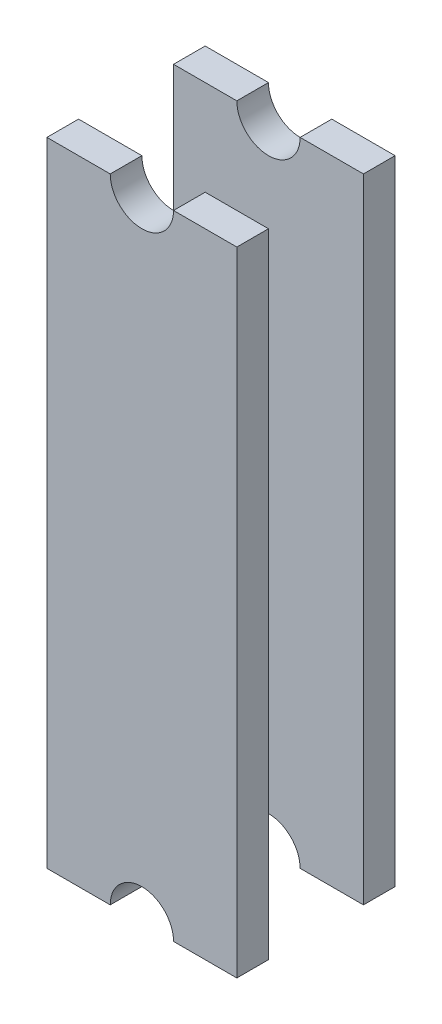
ISO-10303-21;
HEADER;
FILE_DESCRIPTION(('STEP AP214'),'2;1');
FILE_NAME('part.step','',(''),(''),'','','');
FILE_SCHEMA(('AUTOMOTIVE_DESIGN { 1 0 10303 214 1 1 1 1 }'));
ENDSEC;
DATA;
#1=APPLICATION_CONTEXT('core data for automotive mechanical design processes');
#2=APPLICATION_PROTOCOL_DEFINITION('international standard','automotive_design',2000,#1);
#3=PRODUCT_CONTEXT('',#1,'mechanical');
#4=PRODUCT('Part','Part','',(#3));
#5=PRODUCT_RELATED_PRODUCT_CATEGORY('part','',(#4));
#6=PRODUCT_DEFINITION_FORMATION('','',#4);
#7=PRODUCT_DEFINITION_CONTEXT('part definition',#1,'design');
#8=PRODUCT_DEFINITION('design','',#6,#7);
#9=PRODUCT_DEFINITION_SHAPE('','',#8);
#10=(LENGTH_UNIT() NAMED_UNIT(*) SI_UNIT(.MILLI.,.METRE.));
#11=(NAMED_UNIT(*) PLANE_ANGLE_UNIT() SI_UNIT($,.RADIAN.));
#12=(NAMED_UNIT(*) SI_UNIT($,.STERADIAN.) SOLID_ANGLE_UNIT());
#13=UNCERTAINTY_MEASURE_WITH_UNIT(LENGTH_MEASURE(1.E-05),#10,'distance_accuracy_value','');
#14=(GEOMETRIC_REPRESENTATION_CONTEXT(3) GLOBAL_UNCERTAINTY_ASSIGNED_CONTEXT((#13)) GLOBAL_UNIT_ASSIGNED_CONTEXT((#10,
#11,#12)) REPRESENTATION_CONTEXT('',''));
#15=CARTESIAN_POINT('',(0.,0.,0.));
#16=DIRECTION('',(0.,0.,1.));
#17=DIRECTION('',(1.,0.,0.));
#18=AXIS2_PLACEMENT_3D('',#15,#16,#17);
#19=CARTESIAN_POINT('',(-30.,200.,50.));
#20=DIRECTION('',(0.,-1.,0.));
#21=DIRECTION('',(0.,0.,-1.));
#22=AXIS2_PLACEMENT_3D('',#19,#20,#21);
#23=PLANE('',#22);
#24=DIRECTION('',(0.,0.,-1.));
#25=VECTOR('',#24,1.);
#26=CARTESIAN_POINT('',(-10.,200.,100.));
#27=LINE('',#26,#25);
#28=CARTESIAN_POINT('',(-10.,200.,40.));
#29=VERTEX_POINT('',#28);
#30=CARTESIAN_POINT('',(-10.,200.,50.));
#31=VERTEX_POINT('',#30);
#32=EDGE_CURVE('E115',#29,#31,#27,.F.);
#33=ORIENTED_EDGE('',*,*,#32,.F.);
#34=DIRECTION('',(-1.,0.,0.));
#35=VECTOR('',#34,1.);
#36=CARTESIAN_POINT('',(-30.,200.,40.));
#37=LINE('',#36,#35);
#38=CARTESIAN_POINT('',(-30.,200.,40.));
#39=VERTEX_POINT('',#38);
#40=EDGE_CURVE('E121',#29,#39,#37,.T.);
#41=ORIENTED_EDGE('',*,*,#40,.T.);
#42=DIRECTION('',(0.,0.,-1.));
#43=VECTOR('',#42,1.);
#44=CARTESIAN_POINT('',(-30.,200.,50.));
#45=LINE('',#44,#43);
#46=CARTESIAN_POINT('',(-30.,200.,50.));
#47=VERTEX_POINT('',#46);
#48=EDGE_CURVE('E155',#47,#39,#45,.T.);
#49=ORIENTED_EDGE('',*,*,#48,.F.);
#50=DIRECTION('',(-1.,0.,0.));
#51=VECTOR('',#50,1.);
#52=CARTESIAN_POINT('',(-30.,200.,50.));
#53=LINE('',#52,#51);
#54=EDGE_CURVE('E122',#31,#47,#53,.T.);
#55=ORIENTED_EDGE('',*,*,#54,.F.);
#56=EDGE_LOOP('',(#33,#41,#49,#55));
#57=FACE_BOUND('',#56,.T.);
#58=ADVANCED_FACE('F47',(#57),#23,.F.);
#59=DIRECTION('',(0.,0.,-1.));
#60=VECTOR('',#59,1.);
#61=CARTESIAN_POINT('',(10.,200.,100.));
#62=LINE('',#61,#60);
#63=CARTESIAN_POINT('',(10.,200.,50.));
#64=VERTEX_POINT('',#63);
#65=CARTESIAN_POINT('',(10.,200.,40.));
#66=VERTEX_POINT('',#65);
#67=EDGE_CURVE('E65',#64,#66,#62,.T.);
#68=ORIENTED_EDGE('',*,*,#67,.F.);
#69=CARTESIAN_POINT('',(30.,200.,50.));
#70=VERTEX_POINT('',#69);
#71=EDGE_CURVE('E157',#70,#64,#53,.T.);
#72=ORIENTED_EDGE('',*,*,#71,.F.);
#73=DIRECTION('',(0.,0.,-1.));
#74=VECTOR('',#73,1.);
#75=CARTESIAN_POINT('',(30.,200.,50.));
#76=LINE('',#75,#74);
#77=CARTESIAN_POINT('',(30.,200.,40.));
#78=VERTEX_POINT('',#77);
#79=EDGE_CURVE('E119',#70,#78,#76,.T.);
#80=ORIENTED_EDGE('',*,*,#79,.T.);
#81=EDGE_CURVE('E133',#78,#66,#37,.T.);
#82=ORIENTED_EDGE('',*,*,#81,.T.);
#83=EDGE_LOOP('',(#68,#72,#80,#82));
#84=FACE_BOUND('',#83,.T.);
#85=ADVANCED_FACE('F160',(#84),#23,.F.);
#86=CARTESIAN_POINT('',(-30.,0.,50.));
#87=DIRECTION('',(0.,1.,0.));
#88=DIRECTION('',(0.,0.,1.));
#89=AXIS2_PLACEMENT_3D('',#86,#87,#88);
#90=PLANE('',#89);
#91=DIRECTION('',(0.,0.,-1.));
#92=VECTOR('',#91,1.);
#93=CARTESIAN_POINT('',(10.,0.,100.));
#94=LINE('',#93,#92);
#95=CARTESIAN_POINT('',(10.,0.,40.));
#96=VERTEX_POINT('',#95);
#97=CARTESIAN_POINT('',(10.,0.,50.));
#98=VERTEX_POINT('',#97);
#99=EDGE_CURVE('E166',#96,#98,#94,.F.);
#100=ORIENTED_EDGE('',*,*,#99,.F.);
#101=DIRECTION('',(1.,0.,0.));
#102=VECTOR('',#101,1.);
#103=CARTESIAN_POINT('',(-30.,0.,40.));
#104=LINE('',#103,#102);
#105=CARTESIAN_POINT('',(30.,0.,40.));
#106=VERTEX_POINT('',#105);
#107=EDGE_CURVE('E139',#96,#106,#104,.T.);
#108=ORIENTED_EDGE('',*,*,#107,.T.);
#109=DIRECTION('',(0.,0.,-1.));
#110=VECTOR('',#109,1.);
#111=CARTESIAN_POINT('',(30.,0.,50.));
#112=LINE('',#111,#110);
#113=CARTESIAN_POINT('',(30.,0.,50.));
#114=VERTEX_POINT('',#113);
#115=EDGE_CURVE('E144',#114,#106,#112,.T.);
#116=ORIENTED_EDGE('',*,*,#115,.F.);
#117=DIRECTION('',(1.,0.,0.));
#118=VECTOR('',#117,1.);
#119=CARTESIAN_POINT('',(-30.,0.,50.));
#120=LINE('',#119,#118);
#121=EDGE_CURVE('E168',#98,#114,#120,.T.);
#122=ORIENTED_EDGE('',*,*,#121,.F.);
#123=EDGE_LOOP('',(#100,#108,#116,#122));
#124=FACE_BOUND('',#123,.T.);
#125=ADVANCED_FACE('F170',(#124),#90,.F.);
#126=DIRECTION('',(0.,0.,-1.));
#127=VECTOR('',#126,1.);
#128=CARTESIAN_POINT('',(-10.,0.,100.));
#129=LINE('',#128,#127);
#130=CARTESIAN_POINT('',(-10.,0.,50.));
#131=VERTEX_POINT('',#130);
#132=CARTESIAN_POINT('',(-10.,0.,40.));
#133=VERTEX_POINT('',#132);
#134=EDGE_CURVE('E75',#131,#133,#129,.T.);
#135=ORIENTED_EDGE('',*,*,#134,.F.);
#136=CARTESIAN_POINT('',(-30.,0.,50.));
#137=VERTEX_POINT('',#136);
#138=EDGE_CURVE('E149',#137,#131,#120,.T.);
#139=ORIENTED_EDGE('',*,*,#138,.F.);
#140=DIRECTION('',(0.,0.,-1.));
#141=VECTOR('',#140,1.);
#142=CARTESIAN_POINT('',(-30.,0.,50.));
#143=LINE('',#142,#141);
#144=CARTESIAN_POINT('',(-30.,0.,40.));
#145=VERTEX_POINT('',#144);
#146=EDGE_CURVE('E146',#137,#145,#143,.T.);
#147=ORIENTED_EDGE('',*,*,#146,.T.);
#148=EDGE_CURVE('E143',#145,#133,#104,.T.);
#149=ORIENTED_EDGE('',*,*,#148,.T.);
#150=EDGE_LOOP('',(#135,#139,#147,#149));
#151=FACE_BOUND('',#150,.T.);
#152=ADVANCED_FACE('F188',(#151),#90,.F.);
#153=CARTESIAN_POINT('',(30.,0.,50.));
#154=DIRECTION('',(-1.,0.,0.));
#155=DIRECTION('',(0.,0.,1.));
#156=AXIS2_PLACEMENT_3D('',#153,#154,#155);
#157=PLANE('',#156);
#158=DIRECTION('',(0.,1.,0.));
#159=VECTOR('',#158,1.);
#160=CARTESIAN_POINT('',(30.,0.,40.));
#161=LINE('',#160,#159);
#162=EDGE_CURVE('E134',#106,#78,#161,.T.);
#163=ORIENTED_EDGE('',*,*,#162,.T.);
#164=ORIENTED_EDGE('',*,*,#79,.F.);
#165=DIRECTION('',(0.,1.,0.));
#166=VECTOR('',#165,1.);
#167=CARTESIAN_POINT('',(30.,0.,50.));
#168=LINE('',#167,#166);
#169=EDGE_CURVE('E145',#114,#70,#168,.T.);
#170=ORIENTED_EDGE('',*,*,#169,.F.);
#171=ORIENTED_EDGE('',*,*,#115,.T.);
#172=EDGE_LOOP('',(#163,#164,#170,#171));
#173=FACE_BOUND('',#172,.T.);
#174=ADVANCED_FACE('F51',(#173),#157,.F.);
#175=CARTESIAN_POINT('',(-30.,0.,50.));
#176=DIRECTION('',(1.,0.,0.));
#177=DIRECTION('',(0.,0.,-1.));
#178=AXIS2_PLACEMENT_3D('',#175,#176,#177);
#179=PLANE('',#178);
#180=DIRECTION('',(0.,-1.,0.));
#181=VECTOR('',#180,1.);
#182=CARTESIAN_POINT('',(-30.,0.,40.));
#183=LINE('',#182,#181);
#184=EDGE_CURVE('E128',#39,#145,#183,.T.);
#185=ORIENTED_EDGE('',*,*,#184,.T.);
#186=ORIENTED_EDGE('',*,*,#146,.F.);
#187=DIRECTION('',(0.,-1.,0.));
#188=VECTOR('',#187,1.);
#189=CARTESIAN_POINT('',(-30.,0.,50.));
#190=LINE('',#189,#188);
#191=EDGE_CURVE('E178',#47,#137,#190,.T.);
#192=ORIENTED_EDGE('',*,*,#191,.F.);
#193=ORIENTED_EDGE('',*,*,#48,.T.);
#194=EDGE_LOOP('',(#185,#186,#192,#193));
#195=FACE_BOUND('',#194,.T.);
#196=ADVANCED_FACE('F186',(#195),#179,.F.);
#197=CARTESIAN_POINT('',(0.,0.,50.));
#198=DIRECTION('',(0.,0.,-1.));
#199=DIRECTION('',(-1.,0.,0.));
#200=AXIS2_PLACEMENT_3D('',#197,#198,#199);
#201=PLANE('',#200);
#202=CARTESIAN_POINT('',(0.,0.,50.));
#203=DIRECTION('',(0.,0.,-1.));
#204=DIRECTION('',(-1.,0.,0.));
#205=AXIS2_PLACEMENT_3D('',#202,#203,#204);
#206=CIRCLE('',#205,10.);
#207=EDGE_CURVE('E131',#98,#131,#206,.F.);
#208=ORIENTED_EDGE('',*,*,#207,.F.);
#209=ORIENTED_EDGE('',*,*,#121,.T.);
#210=ORIENTED_EDGE('',*,*,#169,.T.);
#211=ORIENTED_EDGE('',*,*,#71,.T.);
#212=CARTESIAN_POINT('',(0.,200.,50.));
#213=DIRECTION('',(0.,0.,-1.));
#214=DIRECTION('',(-1.,0.,0.));
#215=AXIS2_PLACEMENT_3D('',#212,#213,#214);
#216=CIRCLE('',#215,10.);
#217=EDGE_CURVE('E123',#31,#64,#216,.F.);
#218=ORIENTED_EDGE('',*,*,#217,.F.);
#219=ORIENTED_EDGE('',*,*,#54,.T.);
#220=ORIENTED_EDGE('',*,*,#191,.T.);
#221=ORIENTED_EDGE('',*,*,#138,.T.);
#222=EDGE_LOOP('',(#208,#209,#210,#211,#218,#219,#220,#221));
#223=FACE_BOUND('',#222,.T.);
#224=ADVANCED_FACE('F181',(#223),#201,.F.);
#225=CARTESIAN_POINT('',(0.,0.,40.));
#226=DIRECTION('',(0.,0.,-1.));
#227=DIRECTION('',(-1.,0.,0.));
#228=AXIS2_PLACEMENT_3D('',#225,#226,#227);
#229=PLANE('',#228);
#230=ORIENTED_EDGE('',*,*,#107,.F.);
#231=CARTESIAN_POINT('',(0.,0.,40.));
#232=DIRECTION('',(0.,0.,-1.));
#233=DIRECTION('',(-1.,0.,0.));
#234=AXIS2_PLACEMENT_3D('',#231,#232,#233);
#235=CIRCLE('',#234,10.);
#236=EDGE_CURVE('E12',#96,#133,#235,.F.);
#237=ORIENTED_EDGE('',*,*,#236,.T.);
#238=ORIENTED_EDGE('',*,*,#148,.F.);
#239=ORIENTED_EDGE('',*,*,#184,.F.);
#240=ORIENTED_EDGE('',*,*,#40,.F.);
#241=CARTESIAN_POINT('',(0.,200.,40.));
#242=DIRECTION('',(0.,0.,-1.));
#243=DIRECTION('',(-1.,0.,0.));
#244=AXIS2_PLACEMENT_3D('',#241,#242,#243);
#245=CIRCLE('',#244,10.);
#246=EDGE_CURVE('E60',#29,#66,#245,.F.);
#247=ORIENTED_EDGE('',*,*,#246,.T.);
#248=ORIENTED_EDGE('',*,*,#81,.F.);
#249=ORIENTED_EDGE('',*,*,#162,.F.);
#250=EDGE_LOOP('',(#230,#237,#238,#239,#240,#247,#248,#249));
#251=FACE_BOUND('',#250,.T.);
#252=ADVANCED_FACE('F126',(#251),#229,.T.);
#253=CARTESIAN_POINT('',(0.,200.,100.));
#254=DIRECTION('',(0.,0.,-1.));
#255=DIRECTION('',(-1.,0.,0.));
#256=AXIS2_PLACEMENT_3D('',#253,#254,#255);
#257=CYLINDRICAL_SURFACE('',#256,10.);
#258=ORIENTED_EDGE('',*,*,#217,.T.);
#259=ORIENTED_EDGE('',*,*,#67,.T.);
#260=ORIENTED_EDGE('',*,*,#246,.F.);
#261=ORIENTED_EDGE('',*,*,#32,.T.);
#262=EDGE_LOOP('',(#258,#259,#260,#261));
#263=FACE_BOUND('',#262,.T.);
#264=ADVANCED_FACE('F112',(#263),#257,.F.);
#265=CARTESIAN_POINT('',(0.,0.,100.));
#266=DIRECTION('',(0.,0.,-1.));
#267=DIRECTION('',(-1.,0.,0.));
#268=AXIS2_PLACEMENT_3D('',#265,#266,#267);
#269=CYLINDRICAL_SURFACE('',#268,10.);
#270=ORIENTED_EDGE('',*,*,#207,.T.);
#271=ORIENTED_EDGE('',*,*,#134,.T.);
#272=ORIENTED_EDGE('',*,*,#236,.F.);
#273=ORIENTED_EDGE('',*,*,#99,.T.);
#274=EDGE_LOOP('',(#270,#271,#272,#273));
#275=FACE_BOUND('',#274,.T.);
#276=ADVANCED_FACE('F184',(#275),#269,.F.);
#277=CLOSED_SHELL('',(#58,#85,#125,#152,#174,#196,#224,#252,#264,#276));
#278=MANIFOLD_SOLID_BREP('B2',#277);
#279=CARTESIAN_POINT('',(-30.,200.,10.));
#280=DIRECTION('',(0.,-1.,0.));
#281=DIRECTION('',(0.,0.,-1.));
#282=AXIS2_PLACEMENT_3D('',#279,#280,#281);
#283=PLANE('',#282);
#284=DIRECTION('',(0.,0.,-1.));
#285=VECTOR('',#284,1.);
#286=CARTESIAN_POINT('',(-10.,200.,100.));
#287=LINE('',#286,#285);
#288=CARTESIAN_POINT('',(-10.,200.,0.));
#289=VERTEX_POINT('',#288);
#290=CARTESIAN_POINT('',(-10.,200.,9.99999999999999));
#291=VERTEX_POINT('',#290);
#292=EDGE_CURVE('E293',#289,#291,#287,.F.);
#293=ORIENTED_EDGE('',*,*,#292,.F.);
#294=DIRECTION('',(-1.,0.,0.));
#295=VECTOR('',#294,1.);
#296=CARTESIAN_POINT('',(-30.,200.,0.));
#297=LINE('',#296,#295);
#298=CARTESIAN_POINT('',(-30.,200.,0.));
#299=VERTEX_POINT('',#298);
#300=EDGE_CURVE('E348',#289,#299,#297,.T.);
#301=ORIENTED_EDGE('',*,*,#300,.T.);
#302=DIRECTION('',(0.,0.,-1.));
#303=VECTOR('',#302,1.);
#304=CARTESIAN_POINT('',(-30.,200.,10.));
#305=LINE('',#304,#303);
#306=CARTESIAN_POINT('',(-30.,200.,10.));
#307=VERTEX_POINT('',#306);
#308=EDGE_CURVE('E375',#307,#299,#305,.T.);
#309=ORIENTED_EDGE('',*,*,#308,.F.);
#310=DIRECTION('',(-1.,0.,0.));
#311=VECTOR('',#310,1.);
#312=CARTESIAN_POINT('',(-30.,200.,10.));
#313=LINE('',#312,#311);
#314=EDGE_CURVE('E400',#291,#307,#313,.T.);
#315=ORIENTED_EDGE('',*,*,#314,.F.);
#316=EDGE_LOOP('',(#293,#301,#309,#315));
#317=FACE_BOUND('',#316,.T.);
#318=ADVANCED_FACE('F271',(#317),#283,.F.);
#319=DIRECTION('',(0.,0.,-1.));
#320=VECTOR('',#319,1.);
#321=CARTESIAN_POINT('',(10.,200.,100.));
#322=LINE('',#321,#320);
#323=CARTESIAN_POINT('',(10.,200.,9.99999999999999));
#324=VERTEX_POINT('',#323);
#325=CARTESIAN_POINT('',(10.,200.,0.));
#326=VERTEX_POINT('',#325);
#327=EDGE_CURVE('E333',#324,#326,#322,.T.);
#328=ORIENTED_EDGE('',*,*,#327,.F.);
#329=CARTESIAN_POINT('',(30.,200.,10.));
#330=VERTEX_POINT('',#329);
#331=EDGE_CURVE('E391',#330,#324,#313,.T.);
#332=ORIENTED_EDGE('',*,*,#331,.F.);
#333=DIRECTION('',(0.,0.,-1.));
#334=VECTOR('',#333,1.);
#335=CARTESIAN_POINT('',(30.,200.,10.));
#336=LINE('',#335,#334);
#337=CARTESIAN_POINT('',(30.,200.,0.));
#338=VERTEX_POINT('',#337);
#339=EDGE_CURVE('E274',#330,#338,#336,.T.);
#340=ORIENTED_EDGE('',*,*,#339,.T.);
#341=EDGE_CURVE('E350',#338,#326,#297,.T.);
#342=ORIENTED_EDGE('',*,*,#341,.T.);
#343=EDGE_LOOP('',(#328,#332,#340,#342));
#344=FACE_BOUND('',#343,.T.);
#345=ADVANCED_FACE('F353',(#344),#283,.F.);
#346=CARTESIAN_POINT('',(-30.,0.,10.));
#347=DIRECTION('',(0.,1.,0.));
#348=DIRECTION('',(0.,0.,1.));
#349=AXIS2_PLACEMENT_3D('',#346,#347,#348);
#350=PLANE('',#349);
#351=DIRECTION('',(0.,0.,-1.));
#352=VECTOR('',#351,1.);
#353=CARTESIAN_POINT('',(10.,0.,100.));
#354=LINE('',#353,#352);
#355=CARTESIAN_POINT('',(10.,0.,0.));
#356=VERTEX_POINT('',#355);
#357=CARTESIAN_POINT('',(10.,0.,9.99999999999999));
#358=VERTEX_POINT('',#357);
#359=EDGE_CURVE('E290',#356,#358,#354,.F.);
#360=ORIENTED_EDGE('',*,*,#359,.F.);
#361=DIRECTION('',(1.,0.,0.));
#362=VECTOR('',#361,1.);
#363=CARTESIAN_POINT('',(-30.,0.,0.));
#364=LINE('',#363,#362);
#365=CARTESIAN_POINT('',(30.,0.,0.));
#366=VERTEX_POINT('',#365);
#367=EDGE_CURVE('E356',#356,#366,#364,.T.);
#368=ORIENTED_EDGE('',*,*,#367,.T.);
#369=DIRECTION('',(0.,0.,-1.));
#370=VECTOR('',#369,1.);
#371=CARTESIAN_POINT('',(30.,0.,10.));
#372=LINE('',#371,#370);
#373=CARTESIAN_POINT('',(30.,0.,10.));
#374=VERTEX_POINT('',#373);
#375=EDGE_CURVE('E368',#374,#366,#372,.T.);
#376=ORIENTED_EDGE('',*,*,#375,.F.);
#377=DIRECTION('',(1.,0.,0.));
#378=VECTOR('',#377,1.);
#379=CARTESIAN_POINT('',(-30.,0.,10.));
#380=LINE('',#379,#378);
#381=EDGE_CURVE('E394',#358,#374,#380,.T.);
#382=ORIENTED_EDGE('',*,*,#381,.F.);
#383=EDGE_LOOP('',(#360,#368,#376,#382));
#384=FACE_BOUND('',#383,.T.);
#385=ADVANCED_FACE('F411',(#384),#350,.F.);
#386=DIRECTION('',(0.,0.,-1.));
#387=VECTOR('',#386,1.);
#388=CARTESIAN_POINT('',(-10.,0.,100.));
#389=LINE('',#388,#387);
#390=CARTESIAN_POINT('',(-10.,0.,9.99999999999999));
#391=VERTEX_POINT('',#390);
#392=CARTESIAN_POINT('',(-10.,0.,0.));
#393=VERTEX_POINT('',#392);
#394=EDGE_CURVE('E386',#391,#393,#389,.T.);
#395=ORIENTED_EDGE('',*,*,#394,.F.);
#396=CARTESIAN_POINT('',(-30.,0.,10.));
#397=VERTEX_POINT('',#396);
#398=EDGE_CURVE('E367',#397,#391,#380,.T.);
#399=ORIENTED_EDGE('',*,*,#398,.F.);
#400=DIRECTION('',(0.,0.,-1.));
#401=VECTOR('',#400,1.);
#402=CARTESIAN_POINT('',(-30.,0.,10.));
#403=LINE('',#402,#401);
#404=CARTESIAN_POINT('',(-30.,0.,0.));
#405=VERTEX_POINT('',#404);
#406=EDGE_CURVE('E369',#397,#405,#403,.T.);
#407=ORIENTED_EDGE('',*,*,#406,.T.);
#408=EDGE_CURVE('E362',#405,#393,#364,.T.);
#409=ORIENTED_EDGE('',*,*,#408,.T.);
#410=EDGE_LOOP('',(#395,#399,#407,#409));
#411=FACE_BOUND('',#410,.T.);
#412=ADVANCED_FACE('F390',(#411),#350,.F.);
#413=CARTESIAN_POINT('',(30.,0.,10.));
#414=DIRECTION('',(-1.,0.,0.));
#415=DIRECTION('',(0.,0.,1.));
#416=AXIS2_PLACEMENT_3D('',#413,#414,#415);
#417=PLANE('',#416);
#418=DIRECTION('',(0.,1.,0.));
#419=VECTOR('',#418,1.);
#420=CARTESIAN_POINT('',(30.,0.,0.));
#421=LINE('',#420,#419);
#422=EDGE_CURVE('E357',#366,#338,#421,.T.);
#423=ORIENTED_EDGE('',*,*,#422,.T.);
#424=ORIENTED_EDGE('',*,*,#339,.F.);
#425=DIRECTION('',(0.,1.,0.));
#426=VECTOR('',#425,1.);
#427=CARTESIAN_POINT('',(30.,0.,10.));
#428=LINE('',#427,#426);
#429=EDGE_CURVE('E364',#374,#330,#428,.T.);
#430=ORIENTED_EDGE('',*,*,#429,.F.);
#431=ORIENTED_EDGE('',*,*,#375,.T.);
#432=EDGE_LOOP('',(#423,#424,#430,#431));
#433=FACE_BOUND('',#432,.T.);
#434=ADVANCED_FACE('F272',(#433),#417,.F.);
#435=CARTESIAN_POINT('',(-30.,0.,10.));
#436=DIRECTION('',(1.,0.,0.));
#437=DIRECTION('',(0.,0.,-1.));
#438=AXIS2_PLACEMENT_3D('',#435,#436,#437);
#439=PLANE('',#438);
#440=DIRECTION('',(0.,-1.,0.));
#441=VECTOR('',#440,1.);
#442=CARTESIAN_POINT('',(-30.,0.,0.));
#443=LINE('',#442,#441);
#444=EDGE_CURVE('E355',#299,#405,#443,.T.);
#445=ORIENTED_EDGE('',*,*,#444,.T.);
#446=ORIENTED_EDGE('',*,*,#406,.F.);
#447=DIRECTION('',(0.,-1.,0.));
#448=VECTOR('',#447,1.);
#449=CARTESIAN_POINT('',(-30.,0.,10.));
#450=LINE('',#449,#448);
#451=EDGE_CURVE('E377',#307,#397,#450,.T.);
#452=ORIENTED_EDGE('',*,*,#451,.F.);
#453=ORIENTED_EDGE('',*,*,#308,.T.);
#454=EDGE_LOOP('',(#445,#446,#452,#453));
#455=FACE_BOUND('',#454,.T.);
#456=ADVANCED_FACE('F380',(#455),#439,.F.);
#457=CARTESIAN_POINT('',(0.,0.,10.));
#458=DIRECTION('',(0.,0.,-1.));
#459=DIRECTION('',(-1.,0.,0.));
#460=AXIS2_PLACEMENT_3D('',#457,#458,#459);
#461=PLANE('',#460);
#462=CARTESIAN_POINT('',(0.,0.,9.99999999999999));
#463=DIRECTION('',(0.,0.,-1.));
#464=DIRECTION('',(-1.,0.,0.));
#465=AXIS2_PLACEMENT_3D('',#462,#463,#464);
#466=CIRCLE('',#465,10.);
#467=EDGE_CURVE('E405',#358,#391,#466,.F.);
#468=ORIENTED_EDGE('',*,*,#467,.F.);
#469=ORIENTED_EDGE('',*,*,#381,.T.);
#470=ORIENTED_EDGE('',*,*,#429,.T.);
#471=ORIENTED_EDGE('',*,*,#331,.T.);
#472=CARTESIAN_POINT('',(0.,200.,9.99999999999999));
#473=DIRECTION('',(0.,0.,-1.));
#474=DIRECTION('',(-1.,0.,0.));
#475=AXIS2_PLACEMENT_3D('',#472,#473,#474);
#476=CIRCLE('',#475,10.);
#477=EDGE_CURVE('E339',#291,#324,#476,.F.);
#478=ORIENTED_EDGE('',*,*,#477,.F.);
#479=ORIENTED_EDGE('',*,*,#314,.T.);
#480=ORIENTED_EDGE('',*,*,#451,.T.);
#481=ORIENTED_EDGE('',*,*,#398,.T.);
#482=EDGE_LOOP('',(#468,#469,#470,#471,#478,#479,#480,#481));
#483=FACE_BOUND('',#482,.T.);
#484=ADVANCED_FACE('F407',(#483),#461,.F.);
#485=CARTESIAN_POINT('',(0.,0.,0.));
#486=DIRECTION('',(0.,0.,-1.));
#487=DIRECTION('',(-1.,0.,0.));
#488=AXIS2_PLACEMENT_3D('',#485,#486,#487);
#489=PLANE('',#488);
#490=ORIENTED_EDGE('',*,*,#367,.F.);
#491=CARTESIAN_POINT('',(0.,0.,0.));
#492=DIRECTION('',(0.,0.,1.));
#493=DIRECTION('',(1.,0.,0.));
#494=AXIS2_PLACEMENT_3D('',#491,#492,#493);
#495=CIRCLE('',#494,10.);
#496=EDGE_CURVE('E383',#356,#393,#495,.T.);
#497=ORIENTED_EDGE('',*,*,#496,.T.);
#498=ORIENTED_EDGE('',*,*,#408,.F.);
#499=ORIENTED_EDGE('',*,*,#444,.F.);
#500=ORIENTED_EDGE('',*,*,#300,.F.);
#501=CARTESIAN_POINT('',(0.,200.,0.));
#502=DIRECTION('',(0.,0.,1.));
#503=DIRECTION('',(1.,0.,0.));
#504=AXIS2_PLACEMENT_3D('',#501,#502,#503);
#505=CIRCLE('',#504,10.);
#506=EDGE_CURVE('E50',#289,#326,#505,.T.);
#507=ORIENTED_EDGE('',*,*,#506,.T.);
#508=ORIENTED_EDGE('',*,*,#341,.F.);
#509=ORIENTED_EDGE('',*,*,#422,.F.);
#510=EDGE_LOOP('',(#490,#497,#498,#499,#500,#507,#508,#509));
#511=FACE_BOUND('',#510,.T.);
#512=ADVANCED_FACE('F344',(#511),#489,.T.);
#513=CARTESIAN_POINT('',(0.,200.,100.));
#514=DIRECTION('',(0.,0.,-1.));
#515=DIRECTION('',(-1.,0.,0.));
#516=AXIS2_PLACEMENT_3D('',#513,#514,#515);
#517=CYLINDRICAL_SURFACE('',#516,10.);
#518=ORIENTED_EDGE('',*,*,#292,.T.);
#519=ORIENTED_EDGE('',*,*,#477,.T.);
#520=ORIENTED_EDGE('',*,*,#327,.T.);
#521=ORIENTED_EDGE('',*,*,#506,.F.);
#522=EDGE_LOOP('',(#518,#519,#520,#521));
#523=FACE_BOUND('',#522,.T.);
#524=ADVANCED_FACE('F338',(#523),#517,.F.);
#525=CARTESIAN_POINT('',(0.,0.,100.));
#526=DIRECTION('',(0.,0.,-1.));
#527=DIRECTION('',(-1.,0.,0.));
#528=AXIS2_PLACEMENT_3D('',#525,#526,#527);
#529=CYLINDRICAL_SURFACE('',#528,10.);
#530=ORIENTED_EDGE('',*,*,#359,.T.);
#531=ORIENTED_EDGE('',*,*,#467,.T.);
#532=ORIENTED_EDGE('',*,*,#394,.T.);
#533=ORIENTED_EDGE('',*,*,#496,.F.);
#534=EDGE_LOOP('',(#530,#531,#532,#533));
#535=FACE_BOUND('',#534,.T.);
#536=ADVANCED_FACE('F408',(#535),#529,.F.);
#537=CLOSED_SHELL('',(#318,#345,#385,#412,#434,#456,#484,#512,#524,#536));
#538=MANIFOLD_SOLID_BREP('B6',#537);
#539=ADVANCED_BREP_SHAPE_REPRESENTATION('',(#18,#278,#538),#14);
#540=SHAPE_DEFINITION_REPRESENTATION(#9,#539);
ENDSEC;
END-ISO-10303-21;
